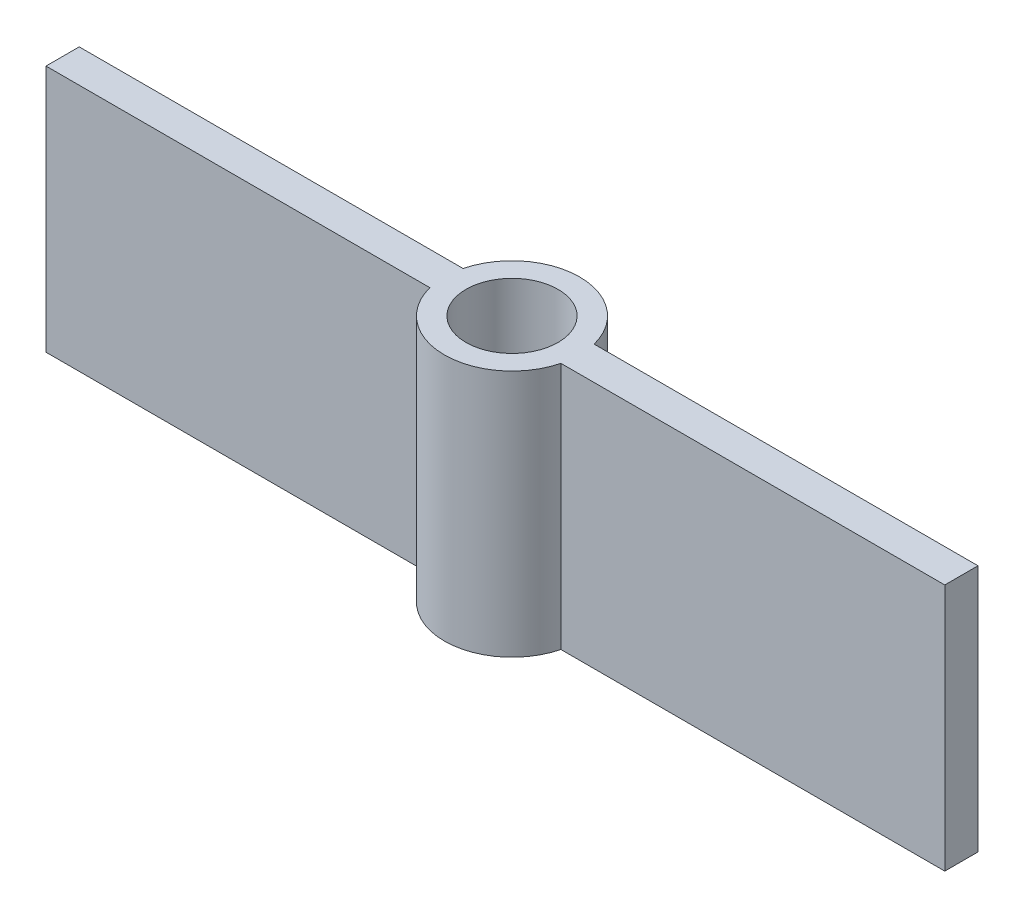
ISO-10303-21;
HEADER;
FILE_DESCRIPTION(('STEP AP214'),'2;1');
FILE_NAME('part.step','',(''),(''),'','','');
FILE_SCHEMA(('AUTOMOTIVE_DESIGN { 1 0 10303 214 1 1 1 1 }'));
ENDSEC;
DATA;
#1=APPLICATION_CONTEXT('core data for automotive mechanical design processes');
#2=APPLICATION_PROTOCOL_DEFINITION('international standard','automotive_design',2000,#1);
#3=PRODUCT_CONTEXT('',#1,'mechanical');
#4=PRODUCT('Part','Part','',(#3));
#5=PRODUCT_RELATED_PRODUCT_CATEGORY('part','',(#4));
#6=PRODUCT_DEFINITION_FORMATION('','',#4);
#7=PRODUCT_DEFINITION_CONTEXT('part definition',#1,'design');
#8=PRODUCT_DEFINITION('design','',#6,#7);
#9=PRODUCT_DEFINITION_SHAPE('','',#8);
#10=(LENGTH_UNIT() NAMED_UNIT(*) SI_UNIT(.MILLI.,.METRE.));
#11=(NAMED_UNIT(*) PLANE_ANGLE_UNIT() SI_UNIT($,.RADIAN.));
#12=(NAMED_UNIT(*) SI_UNIT($,.STERADIAN.) SOLID_ANGLE_UNIT());
#13=UNCERTAINTY_MEASURE_WITH_UNIT(LENGTH_MEASURE(1.E-05),#10,'distance_accuracy_value','');
#14=(GEOMETRIC_REPRESENTATION_CONTEXT(3) GLOBAL_UNCERTAINTY_ASSIGNED_CONTEXT((#13)) GLOBAL_UNIT_ASSIGNED_CONTEXT((#10,
#11,#12)) REPRESENTATION_CONTEXT('',''));
#15=CARTESIAN_POINT('',(0.,0.,0.));
#16=DIRECTION('',(0.,0.,1.));
#17=DIRECTION('',(1.,0.,0.));
#18=AXIS2_PLACEMENT_3D('',#15,#16,#17);
#19=CARTESIAN_POINT('',(2.63851562890876,23.,0.));
#20=DIRECTION('',(0.,-1.,0.));
#21=DIRECTION('',(0.,0.,-1.));
#22=AXIS2_PLACEMENT_3D('',#19,#20,#21);
#23=CYLINDRICAL_SURFACE('',#22,6.27236018923689);
#24=CARTESIAN_POINT('',(2.63851562890876,-0.0001,0.));
#25=DIRECTION('',(0.,1.,0.));
#26=DIRECTION('',(0.,0.,1.));
#27=AXIS2_PLACEMENT_3D('',#24,#25,#26);
#28=CIRCLE('',#27,6.27236018923689);
#29=CARTESIAN_POINT('',(8.71843696457117,-0.0001,-1.54177135));
#30=VERTEX_POINT('',#29);
#31=CARTESIAN_POINT('',(-3.44140570675366,-0.0001,-1.54177135));
#32=VERTEX_POINT('',#31);
#33=EDGE_CURVE('E181',#30,#32,#28,.T.);
#34=ORIENTED_EDGE('',*,*,#33,.T.);
#35=DIRECTION('',(0.,1.,0.));
#36=VECTOR('',#35,1.);
#37=CARTESIAN_POINT('',(-3.44140570675366,-0.0001,-1.54177135));
#38=LINE('',#37,#36);
#39=CARTESIAN_POINT('',(-3.44140570675366,23.,-1.54177135));
#40=VERTEX_POINT('',#39);
#41=EDGE_CURVE('E111',#32,#40,#38,.T.);
#42=ORIENTED_EDGE('',*,*,#41,.T.);
#43=CARTESIAN_POINT('',(2.63851562890876,23.,0.));
#44=DIRECTION('',(0.,1.,0.));
#45=DIRECTION('',(0.,0.,1.));
#46=AXIS2_PLACEMENT_3D('',#43,#44,#45);
#47=CIRCLE('',#46,6.27236018923689);
#48=CARTESIAN_POINT('',(8.71843696457117,23.,-1.54177135));
#49=VERTEX_POINT('',#48);
#50=EDGE_CURVE('E211',#49,#40,#47,.T.);
#51=ORIENTED_EDGE('',*,*,#50,.F.);
#52=DIRECTION('',(0.,-1.,0.));
#53=VECTOR('',#52,1.);
#54=CARTESIAN_POINT('',(8.71843696457117,23.,-1.54177135));
#55=LINE('',#54,#53);
#56=EDGE_CURVE('E225',#49,#30,#55,.T.);
#57=ORIENTED_EDGE('',*,*,#56,.T.);
#58=EDGE_LOOP('',(#34,#42,#51,#57));
#59=FACE_BOUND('',#58,.T.);
#60=ADVANCED_FACE('F107',(#59),#23,.T.);
#61=CARTESIAN_POINT('',(0.,23.,0.));
#62=DIRECTION('',(0.,1.,0.));
#63=DIRECTION('',(0.,0.,1.));
#64=AXIS2_PLACEMENT_3D('',#61,#62,#63);
#65=PLANE('',#64);
#66=CARTESIAN_POINT('',(2.63851562890876,23.,0.));
#67=DIRECTION('',(0.,1.,0.));
#68=DIRECTION('',(0.,0.,1.));
#69=AXIS2_PLACEMENT_3D('',#66,#67,#68);
#70=CIRCLE('',#69,4.27236018923689);
#71=CARTESIAN_POINT('',(2.63851562890876,23.,4.27236018923689));
#72=VERTEX_POINT('',#71);
#73=EDGE_CURVE('E182',#72,#72,#70,.T.);
#74=ORIENTED_EDGE('',*,*,#73,.F.);
#75=EDGE_LOOP('',(#74));
#76=FACE_BOUND('',#75,.T.);
#77=DIRECTION('',(1.,0.,0.));
#78=VECTOR('',#77,1.);
#79=CARTESIAN_POINT('',(0.,23.,1.54177135));
#80=LINE('',#79,#78);
#81=CARTESIAN_POINT('',(-39.0624207917418,23.,1.54177135));
#82=VERTEX_POINT('',#81);
#83=CARTESIAN_POINT('',(-3.44140570675366,23.,1.54177135));
#84=VERTEX_POINT('',#83);
#85=EDGE_CURVE('E240',#82,#84,#80,.T.);
#86=ORIENTED_EDGE('',*,*,#85,.T.);
#87=CARTESIAN_POINT('',(8.71843696457117,23.,1.54177135));
#88=VERTEX_POINT('',#87);
#89=EDGE_CURVE('E210',#84,#88,#47,.T.);
#90=ORIENTED_EDGE('',*,*,#89,.T.);
#91=DIRECTION('',(1.,0.,0.));
#92=VECTOR('',#91,1.);
#93=CARTESIAN_POINT('',(0.,23.,1.54177135));
#94=LINE('',#93,#92);
#95=CARTESIAN_POINT('',(44.3394520495593,23.,1.54177135));
#96=VERTEX_POINT('',#95);
#97=EDGE_CURVE('E189',#88,#96,#94,.T.);
#98=ORIENTED_EDGE('',*,*,#97,.T.);
#99=DIRECTION('',(0.,0.,1.));
#100=VECTOR('',#99,1.);
#101=CARTESIAN_POINT('',(44.3394520495593,23.,0.));
#102=LINE('',#101,#100);
#103=CARTESIAN_POINT('',(44.3394520495593,23.,-1.54177135));
#104=VERTEX_POINT('',#103);
#105=EDGE_CURVE('E217',#104,#96,#102,.T.);
#106=ORIENTED_EDGE('',*,*,#105,.F.);
#107=DIRECTION('',(1.,0.,0.));
#108=VECTOR('',#107,1.);
#109=CARTESIAN_POINT('',(0.,23.,-1.54177135));
#110=LINE('',#109,#108);
#111=EDGE_CURVE('E221',#49,#104,#110,.T.);
#112=ORIENTED_EDGE('',*,*,#111,.F.);
#113=ORIENTED_EDGE('',*,*,#50,.T.);
#114=DIRECTION('',(1.,0.,0.));
#115=VECTOR('',#114,1.);
#116=CARTESIAN_POINT('',(0.,23.,-1.54177135));
#117=LINE('',#116,#115);
#118=CARTESIAN_POINT('',(-39.0624207917418,23.,-1.54177135));
#119=VERTEX_POINT('',#118);
#120=EDGE_CURVE('E191',#119,#40,#117,.T.);
#121=ORIENTED_EDGE('',*,*,#120,.F.);
#122=DIRECTION('',(0.,0.,1.));
#123=VECTOR('',#122,1.);
#124=CARTESIAN_POINT('',(-39.0624207917418,23.,0.));
#125=LINE('',#124,#123);
#126=EDGE_CURVE('E236',#119,#82,#125,.T.);
#127=ORIENTED_EDGE('',*,*,#126,.T.);
#128=EDGE_LOOP('',(#86,#90,#98,#106,#112,#113,#121,#127));
#129=FACE_BOUND('',#128,.T.);
#130=ADVANCED_FACE('F266',(#76,#129),#65,.T.);
#131=CARTESIAN_POINT('',(0.,23.,1.54177135));
#132=DIRECTION('',(0.,0.,-1.));
#133=DIRECTION('',(-1.,0.,0.));
#134=AXIS2_PLACEMENT_3D('',#131,#132,#133);
#135=PLANE('',#134);
#136=DIRECTION('',(0.,-1.,0.));
#137=VECTOR('',#136,1.);
#138=CARTESIAN_POINT('',(8.71843696457117,23.,1.54177135));
#139=LINE('',#138,#137);
#140=CARTESIAN_POINT('',(8.71843696457117,-0.0001,1.54177135));
#141=VERTEX_POINT('',#140);
#142=EDGE_CURVE('E176',#88,#141,#139,.T.);
#143=ORIENTED_EDGE('',*,*,#142,.T.);
#144=DIRECTION('',(1.,0.,0.));
#145=VECTOR('',#144,1.);
#146=CARTESIAN_POINT('',(0.,-0.0001,1.54177135));
#147=LINE('',#146,#145);
#148=CARTESIAN_POINT('',(44.3394520495593,-0.0001,1.54177135));
#149=VERTEX_POINT('',#148);
#150=EDGE_CURVE('E188',#141,#149,#147,.T.);
#151=ORIENTED_EDGE('',*,*,#150,.T.);
#152=DIRECTION('',(0.,-1.,0.));
#153=VECTOR('',#152,1.);
#154=CARTESIAN_POINT('',(44.3394520495593,23.,1.54177135));
#155=LINE('',#154,#153);
#156=EDGE_CURVE('E192',#96,#149,#155,.T.);
#157=ORIENTED_EDGE('',*,*,#156,.F.);
#158=ORIENTED_EDGE('',*,*,#97,.F.);
#159=EDGE_LOOP('',(#143,#151,#157,#158));
#160=FACE_BOUND('',#159,.T.);
#161=ADVANCED_FACE('F186',(#160),#135,.F.);
#162=CARTESIAN_POINT('',(44.3394520495593,23.,0.));
#163=DIRECTION('',(1.,0.,0.));
#164=DIRECTION('',(0.,0.,-1.));
#165=AXIS2_PLACEMENT_3D('',#162,#163,#164);
#166=PLANE('',#165);
#167=ORIENTED_EDGE('',*,*,#156,.T.);
#168=DIRECTION('',(0.,0.,1.));
#169=VECTOR('',#168,1.);
#170=CARTESIAN_POINT('',(44.3394520495593,-0.0001,0.));
#171=LINE('',#170,#169);
#172=CARTESIAN_POINT('',(44.3394520495593,-0.0001,-1.54177135));
#173=VERTEX_POINT('',#172);
#174=EDGE_CURVE('E198',#173,#149,#171,.T.);
#175=ORIENTED_EDGE('',*,*,#174,.F.);
#176=DIRECTION('',(0.,-1.,0.));
#177=VECTOR('',#176,1.);
#178=CARTESIAN_POINT('',(44.3394520495593,23.,-1.54177135));
#179=LINE('',#178,#177);
#180=EDGE_CURVE('E228',#104,#173,#179,.T.);
#181=ORIENTED_EDGE('',*,*,#180,.F.);
#182=ORIENTED_EDGE('',*,*,#105,.T.);
#183=EDGE_LOOP('',(#167,#175,#181,#182));
#184=FACE_BOUND('',#183,.T.);
#185=ADVANCED_FACE('F296',(#184),#166,.T.);
#186=CARTESIAN_POINT('',(0.,23.,-1.54177135));
#187=DIRECTION('',(0.,0.,-1.));
#188=DIRECTION('',(-1.,0.,0.));
#189=AXIS2_PLACEMENT_3D('',#186,#187,#188);
#190=PLANE('',#189);
#191=ORIENTED_EDGE('',*,*,#180,.T.);
#192=DIRECTION('',(1.,0.,0.));
#193=VECTOR('',#192,1.);
#194=CARTESIAN_POINT('',(0.,-0.0001,-1.54177135));
#195=LINE('',#194,#193);
#196=EDGE_CURVE('E203',#30,#173,#195,.T.);
#197=ORIENTED_EDGE('',*,*,#196,.F.);
#198=ORIENTED_EDGE('',*,*,#56,.F.);
#199=ORIENTED_EDGE('',*,*,#111,.T.);
#200=EDGE_LOOP('',(#191,#197,#198,#199));
#201=FACE_BOUND('',#200,.T.);
#202=ADVANCED_FACE('F290',(#201),#190,.T.);
#203=DIRECTION('',(0.,1.,0.));
#204=VECTOR('',#203,1.);
#205=CARTESIAN_POINT('',(-3.44140570675366,-0.0001,1.54177135));
#206=LINE('',#205,#204);
#207=CARTESIAN_POINT('',(-3.44140570675366,-0.0001,1.54177135));
#208=VERTEX_POINT('',#207);
#209=EDGE_CURVE('E12',#208,#84,#206,.T.);
#210=ORIENTED_EDGE('',*,*,#209,.F.);
#211=EDGE_CURVE('E172',#208,#141,#28,.T.);
#212=ORIENTED_EDGE('',*,*,#211,.T.);
#213=ORIENTED_EDGE('',*,*,#142,.F.);
#214=ORIENTED_EDGE('',*,*,#89,.F.);
#215=EDGE_LOOP('',(#210,#212,#213,#214));
#216=FACE_BOUND('',#215,.T.);
#217=ADVANCED_FACE('F174',(#216),#23,.T.);
#218=CARTESIAN_POINT('',(0.,-0.0001,1.54177135));
#219=DIRECTION('',(0.,0.,1.));
#220=DIRECTION('',(1.,0.,0.));
#221=AXIS2_PLACEMENT_3D('',#218,#219,#220);
#222=PLANE('',#221);
#223=ORIENTED_EDGE('',*,*,#209,.T.);
#224=ORIENTED_EDGE('',*,*,#85,.F.);
#225=DIRECTION('',(0.,1.,0.));
#226=VECTOR('',#225,1.);
#227=CARTESIAN_POINT('',(-39.0624207917418,-0.0001,1.54177135));
#228=LINE('',#227,#226);
#229=CARTESIAN_POINT('',(-39.0624207917418,-0.0001,1.54177135));
#230=VERTEX_POINT('',#229);
#231=EDGE_CURVE('E117',#230,#82,#228,.T.);
#232=ORIENTED_EDGE('',*,*,#231,.F.);
#233=DIRECTION('',(1.,0.,0.));
#234=VECTOR('',#233,1.);
#235=CARTESIAN_POINT('',(0.,-0.0001,1.54177135));
#236=LINE('',#235,#234);
#237=EDGE_CURVE('E124',#230,#208,#236,.T.);
#238=ORIENTED_EDGE('',*,*,#237,.T.);
#239=EDGE_LOOP('',(#223,#224,#232,#238));
#240=FACE_BOUND('',#239,.T.);
#241=ADVANCED_FACE('F278',(#240),#222,.T.);
#242=CARTESIAN_POINT('',(-39.0624207917418,-0.0001,0.));
#243=DIRECTION('',(-1.,0.,0.));
#244=DIRECTION('',(0.,0.,1.));
#245=AXIS2_PLACEMENT_3D('',#242,#243,#244);
#246=PLANE('',#245);
#247=ORIENTED_EDGE('',*,*,#231,.T.);
#248=ORIENTED_EDGE('',*,*,#126,.F.);
#249=DIRECTION('',(0.,1.,0.));
#250=VECTOR('',#249,1.);
#251=CARTESIAN_POINT('',(-39.0624207917418,-0.0001,-1.54177135));
#252=LINE('',#251,#250);
#253=CARTESIAN_POINT('',(-39.0624207917418,-0.0001,-1.54177135));
#254=VERTEX_POINT('',#253);
#255=EDGE_CURVE('E253',#254,#119,#252,.T.);
#256=ORIENTED_EDGE('',*,*,#255,.F.);
#257=DIRECTION('',(0.,0.,1.));
#258=VECTOR('',#257,1.);
#259=CARTESIAN_POINT('',(-39.0624207917418,-0.0001,0.));
#260=LINE('',#259,#258);
#261=EDGE_CURVE('E247',#254,#230,#260,.T.);
#262=ORIENTED_EDGE('',*,*,#261,.T.);
#263=EDGE_LOOP('',(#247,#248,#256,#262));
#264=FACE_BOUND('',#263,.T.);
#265=ADVANCED_FACE('F269',(#264),#246,.T.);
#266=CARTESIAN_POINT('',(0.,-0.0001,-1.54177135));
#267=DIRECTION('',(0.,0.,1.));
#268=DIRECTION('',(1.,0.,0.));
#269=AXIS2_PLACEMENT_3D('',#266,#267,#268);
#270=PLANE('',#269);
#271=ORIENTED_EDGE('',*,*,#255,.T.);
#272=ORIENTED_EDGE('',*,*,#120,.T.);
#273=ORIENTED_EDGE('',*,*,#41,.F.);
#274=DIRECTION('',(1.,0.,0.));
#275=VECTOR('',#274,1.);
#276=CARTESIAN_POINT('',(0.,-0.0001,-1.54177135));
#277=LINE('',#276,#275);
#278=EDGE_CURVE('E244',#254,#32,#277,.T.);
#279=ORIENTED_EDGE('',*,*,#278,.F.);
#280=EDGE_LOOP('',(#271,#272,#273,#279));
#281=FACE_BOUND('',#280,.T.);
#282=ADVANCED_FACE('F109',(#281),#270,.F.);
#283=CARTESIAN_POINT('',(0.,-0.0001,0.));
#284=DIRECTION('',(0.,1.,0.));
#285=DIRECTION('',(0.,0.,1.));
#286=AXIS2_PLACEMENT_3D('',#283,#284,#285);
#287=PLANE('',#286);
#288=CARTESIAN_POINT('',(2.63851562890876,-9.99999999994061E-05,0.));
#289=DIRECTION('',(0.,1.,0.));
#290=DIRECTION('',(0.,0.,1.));
#291=AXIS2_PLACEMENT_3D('',#288,#289,#290);
#292=CIRCLE('',#291,4.27236018923689);
#293=CARTESIAN_POINT('',(2.63851562890876,-9.99999999994061E-05,4.27236018923689));
#294=VERTEX_POINT('',#293);
#295=EDGE_CURVE('E366',#294,#294,#292,.T.);
#296=ORIENTED_EDGE('',*,*,#295,.T.);
#297=EDGE_LOOP('',(#296));
#298=FACE_BOUND('',#297,.T.);
#299=ORIENTED_EDGE('',*,*,#278,.T.);
#300=ORIENTED_EDGE('',*,*,#33,.F.);
#301=ORIENTED_EDGE('',*,*,#196,.T.);
#302=ORIENTED_EDGE('',*,*,#174,.T.);
#303=ORIENTED_EDGE('',*,*,#150,.F.);
#304=ORIENTED_EDGE('',*,*,#211,.F.);
#305=ORIENTED_EDGE('',*,*,#237,.F.);
#306=ORIENTED_EDGE('',*,*,#261,.F.);
#307=EDGE_LOOP('',(#299,#300,#301,#302,#303,#304,#305,#306));
#308=FACE_BOUND('',#307,.T.);
#309=ADVANCED_FACE('F195',(#298,#308),#287,.F.);
#310=CARTESIAN_POINT('',(2.63851562890876,23.,0.));
#311=DIRECTION('',(0.,-1.,0.));
#312=DIRECTION('',(0.,0.,-1.));
#313=AXIS2_PLACEMENT_3D('',#310,#311,#312);
#314=CYLINDRICAL_SURFACE('',#313,4.27236018923689);
#315=ORIENTED_EDGE('',*,*,#295,.F.);
#316=EDGE_LOOP('',(#315));
#317=FACE_BOUND('',#316,.T.);
#318=ORIENTED_EDGE('',*,*,#73,.T.);
#319=EDGE_LOOP('',(#318));
#320=FACE_BOUND('',#319,.T.);
#321=ADVANCED_FACE('F275',(#317,#320),#314,.F.);
#322=CLOSED_SHELL('',(#60,#130,#161,#185,#202,#217,#241,#265,#282,#309,#321));
#323=MANIFOLD_SOLID_BREP('B2',#322);
#324=ADVANCED_BREP_SHAPE_REPRESENTATION('',(#18,#323),#14);
#325=SHAPE_DEFINITION_REPRESENTATION(#9,#324);
ENDSEC;
END-ISO-10303-21;
